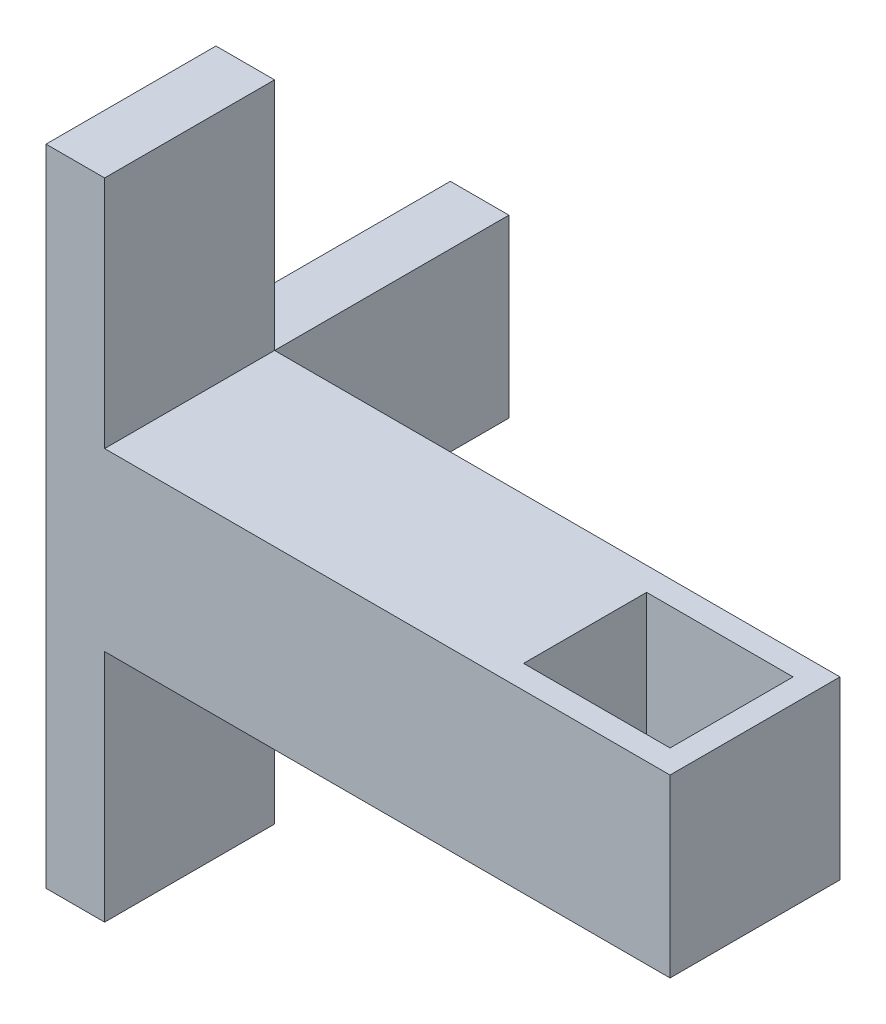
ISO-10303-21;
HEADER;
FILE_DESCRIPTION(('STEP AP214'),'2;1');
FILE_NAME('part.step','',(''),(''),'','','');
FILE_SCHEMA(('AUTOMOTIVE_DESIGN { 1 0 10303 214 1 1 1 1 }'));
ENDSEC;
DATA;
#1=APPLICATION_CONTEXT('core data for automotive mechanical design processes');
#2=APPLICATION_PROTOCOL_DEFINITION('international standard','automotive_design',2000,#1);
#3=PRODUCT_CONTEXT('',#1,'mechanical');
#4=PRODUCT('Part','Part','',(#3));
#5=PRODUCT_RELATED_PRODUCT_CATEGORY('part','',(#4));
#6=PRODUCT_DEFINITION_FORMATION('','',#4);
#7=PRODUCT_DEFINITION_CONTEXT('part definition',#1,'design');
#8=PRODUCT_DEFINITION('design','',#6,#7);
#9=PRODUCT_DEFINITION_SHAPE('','',#8);
#10=(LENGTH_UNIT() NAMED_UNIT(*) SI_UNIT(.MILLI.,.METRE.));
#11=(NAMED_UNIT(*) PLANE_ANGLE_UNIT() SI_UNIT($,.RADIAN.));
#12=(NAMED_UNIT(*) SI_UNIT($,.STERADIAN.) SOLID_ANGLE_UNIT());
#13=UNCERTAINTY_MEASURE_WITH_UNIT(LENGTH_MEASURE(1.E-05),#10,'distance_accuracy_value','');
#14=(GEOMETRIC_REPRESENTATION_CONTEXT(3) GLOBAL_UNCERTAINTY_ASSIGNED_CONTEXT((#13)) GLOBAL_UNIT_ASSIGNED_CONTEXT((#10,
#11,#12)) REPRESENTATION_CONTEXT('',''));
#15=CARTESIAN_POINT('',(0.,0.,0.));
#16=DIRECTION('',(0.,0.,1.));
#17=DIRECTION('',(1.,0.,0.));
#18=AXIS2_PLACEMENT_3D('',#15,#16,#17);
#19=CARTESIAN_POINT('',(0.,15.,0.));
#20=DIRECTION('',(0.,1.,0.));
#21=DIRECTION('',(0.,0.,1.));
#22=AXIS2_PLACEMENT_3D('',#19,#20,#21);
#23=PLANE('',#22);
#24=DIRECTION('',(-1.,0.,0.));
#25=VECTOR('',#24,1.);
#26=CARTESIAN_POINT('',(0.,15.,-2.));
#27=LINE('',#26,#25);
#28=CARTESIAN_POINT('',(-33.75,15.,-2.));
#29=VERTEX_POINT('',#28);
#30=CARTESIAN_POINT('',(-38.75,15.,-2.));
#31=VERTEX_POINT('',#30);
#32=EDGE_CURVE('E157',#29,#31,#27,.T.);
#33=ORIENTED_EDGE('',*,*,#32,.F.);
#34=DIRECTION('',(0.,0.,-1.));
#35=VECTOR('',#34,1.);
#36=CARTESIAN_POINT('',(-33.75,15.,0.));
#37=LINE('',#36,#35);
#38=CARTESIAN_POINT('',(-33.75,15.,-22.));
#39=VERTEX_POINT('',#38);
#40=EDGE_CURVE('E226',#29,#39,#37,.T.);
#41=ORIENTED_EDGE('',*,*,#40,.T.);
#42=DIRECTION('',(-1.,0.,0.));
#43=VECTOR('',#42,1.);
#44=CARTESIAN_POINT('',(0.,15.,-22.));
#45=LINE('',#44,#43);
#46=CARTESIAN_POINT('',(-38.75,15.,-22.));
#47=VERTEX_POINT('',#46);
#48=EDGE_CURVE('E229',#39,#47,#45,.T.);
#49=ORIENTED_EDGE('',*,*,#48,.T.);
#50=DIRECTION('',(0.,0.,1.));
#51=VECTOR('',#50,1.);
#52=CARTESIAN_POINT('',(-38.75,15.,0.));
#53=LINE('',#52,#51);
#54=EDGE_CURVE('E57',#47,#31,#53,.T.);
#55=ORIENTED_EDGE('',*,*,#54,.T.);
#56=EDGE_LOOP('',(#33,#41,#49,#55));
#57=FACE_BOUND('',#56,.T.);
#58=ADVANCED_FACE('F41',(#57),#23,.T.);
#59=CARTESIAN_POINT('',(0.,0.,0.));
#60=DIRECTION('',(0.,1.,0.));
#61=DIRECTION('',(0.,0.,1.));
#62=AXIS2_PLACEMENT_3D('',#59,#60,#61);
#63=PLANE('',#62);
#64=DIRECTION('',(0.,0.,-1.));
#65=VECTOR('',#64,1.);
#66=CARTESIAN_POINT('',(-33.75,0.,0.));
#67=LINE('',#66,#65);
#68=CARTESIAN_POINT('',(-33.75,0.,-2.));
#69=VERTEX_POINT('',#68);
#70=CARTESIAN_POINT('',(-33.75,0.,-22.));
#71=VERTEX_POINT('',#70);
#72=EDGE_CURVE('E260',#69,#71,#67,.T.);
#73=ORIENTED_EDGE('',*,*,#72,.F.);
#74=DIRECTION('',(-1.,0.,0.));
#75=VECTOR('',#74,1.);
#76=CARTESIAN_POINT('',(0.,0.,-2.));
#77=LINE('',#76,#75);
#78=CARTESIAN_POINT('',(-38.75,0.,-2.));
#79=VERTEX_POINT('',#78);
#80=EDGE_CURVE('E11',#69,#79,#77,.T.);
#81=ORIENTED_EDGE('',*,*,#80,.T.);
#82=DIRECTION('',(0.,0.,1.));
#83=VECTOR('',#82,1.);
#84=CARTESIAN_POINT('',(-38.75,0.,0.));
#85=LINE('',#84,#83);
#86=CARTESIAN_POINT('',(-38.75,0.,-22.));
#87=VERTEX_POINT('',#86);
#88=EDGE_CURVE('E266',#87,#79,#85,.T.);
#89=ORIENTED_EDGE('',*,*,#88,.F.);
#90=DIRECTION('',(-1.,0.,0.));
#91=VECTOR('',#90,1.);
#92=CARTESIAN_POINT('',(0.,0.,-22.));
#93=LINE('',#92,#91);
#94=EDGE_CURVE('E263',#71,#87,#93,.T.);
#95=ORIENTED_EDGE('',*,*,#94,.F.);
#96=EDGE_LOOP('',(#73,#81,#89,#95));
#97=FACE_BOUND('',#96,.T.);
#98=ADVANCED_FACE('F334',(#97),#63,.F.);
#99=CARTESIAN_POINT('',(0.,15.,0.));
#100=DIRECTION('',(0.,0.,-1.));
#101=DIRECTION('',(-1.,0.,0.));
#102=AXIS2_PLACEMENT_3D('',#99,#100,#101);
#103=PLANE('',#102);
#104=DIRECTION('',(1.,0.,0.));
#105=VECTOR('',#104,1.);
#106=CARTESIAN_POINT('',(0.,0.,0.));
#107=LINE('',#106,#105);
#108=CARTESIAN_POINT('',(0.,0.,0.));
#109=VERTEX_POINT('',#108);
#110=CARTESIAN_POINT('',(12.5,0.,0.));
#111=VERTEX_POINT('',#110);
#112=EDGE_CURVE('E269',#109,#111,#107,.T.);
#113=ORIENTED_EDGE('',*,*,#112,.T.);
#114=DIRECTION('',(0.,-1.,0.));
#115=VECTOR('',#114,1.);
#116=CARTESIAN_POINT('',(12.5,15.,0.));
#117=LINE('',#116,#115);
#118=CARTESIAN_POINT('',(12.5,15.,0.));
#119=VERTEX_POINT('',#118);
#120=EDGE_CURVE('E294',#119,#111,#117,.T.);
#121=ORIENTED_EDGE('',*,*,#120,.F.);
#122=DIRECTION('',(1.,0.,0.));
#123=VECTOR('',#122,1.);
#124=CARTESIAN_POINT('',(0.,15.,0.));
#125=LINE('',#124,#123);
#126=CARTESIAN_POINT('',(0.,15.,0.));
#127=VERTEX_POINT('',#126);
#128=EDGE_CURVE('E234',#127,#119,#125,.T.);
#129=ORIENTED_EDGE('',*,*,#128,.F.);
#130=DIRECTION('',(0.,-1.,0.));
#131=VECTOR('',#130,1.);
#132=CARTESIAN_POINT('',(0.,15.,0.));
#133=LINE('',#132,#131);
#134=EDGE_CURVE('E284',#127,#109,#133,.T.);
#135=ORIENTED_EDGE('',*,*,#134,.T.);
#136=EDGE_LOOP('',(#113,#121,#129,#135));
#137=FACE_BOUND('',#136,.T.);
#138=ADVANCED_FACE('F361',(#137),#103,.F.);
#139=CARTESIAN_POINT('',(12.5,15.,0.));
#140=DIRECTION('',(1.,0.,0.));
#141=DIRECTION('',(0.,0.,-1.));
#142=AXIS2_PLACEMENT_3D('',#139,#140,#141);
#143=PLANE('',#142);
#144=DIRECTION('',(0.,0.,1.));
#145=VECTOR('',#144,1.);
#146=CARTESIAN_POINT('',(12.5,0.,0.));
#147=LINE('',#146,#145);
#148=CARTESIAN_POINT('',(12.5,0.,10.5));
#149=VERTEX_POINT('',#148);
#150=EDGE_CURVE('E273',#111,#149,#147,.T.);
#151=ORIENTED_EDGE('',*,*,#150,.T.);
#152=DIRECTION('',(0.,-1.,0.));
#153=VECTOR('',#152,1.);
#154=CARTESIAN_POINT('',(12.5,15.,10.5));
#155=LINE('',#154,#153);
#156=CARTESIAN_POINT('',(12.5,15.,10.5));
#157=VERTEX_POINT('',#156);
#158=EDGE_CURVE('E291',#157,#149,#155,.T.);
#159=ORIENTED_EDGE('',*,*,#158,.F.);
#160=DIRECTION('',(0.,0.,1.));
#161=VECTOR('',#160,1.);
#162=CARTESIAN_POINT('',(12.5,15.,0.));
#163=LINE('',#162,#161);
#164=EDGE_CURVE('E238',#119,#157,#163,.T.);
#165=ORIENTED_EDGE('',*,*,#164,.F.);
#166=ORIENTED_EDGE('',*,*,#120,.T.);
#167=EDGE_LOOP('',(#151,#159,#165,#166));
#168=FACE_BOUND('',#167,.T.);
#169=ADVANCED_FACE('F364',(#168),#143,.F.);
#170=CARTESIAN_POINT('',(0.,15.,10.5));
#171=DIRECTION('',(0.,0.,-1.));
#172=DIRECTION('',(-1.,0.,0.));
#173=AXIS2_PLACEMENT_3D('',#170,#171,#172);
#174=PLANE('',#173);
#175=DIRECTION('',(1.,0.,0.));
#176=VECTOR('',#175,1.);
#177=CARTESIAN_POINT('',(0.,0.,10.5));
#178=LINE('',#177,#176);
#179=CARTESIAN_POINT('',(0.,0.,10.5));
#180=VERTEX_POINT('',#179);
#181=EDGE_CURVE('E277',#180,#149,#178,.T.);
#182=ORIENTED_EDGE('',*,*,#181,.F.);
#183=DIRECTION('',(0.,-1.,0.));
#184=VECTOR('',#183,1.);
#185=CARTESIAN_POINT('',(0.,15.,10.5));
#186=LINE('',#185,#184);
#187=CARTESIAN_POINT('',(0.,15.,10.5));
#188=VERTEX_POINT('',#187);
#189=EDGE_CURVE('E287',#188,#180,#186,.T.);
#190=ORIENTED_EDGE('',*,*,#189,.F.);
#191=DIRECTION('',(1.,0.,0.));
#192=VECTOR('',#191,1.);
#193=CARTESIAN_POINT('',(0.,15.,10.5));
#194=LINE('',#193,#192);
#195=EDGE_CURVE('E241',#188,#157,#194,.T.);
#196=ORIENTED_EDGE('',*,*,#195,.T.);
#197=ORIENTED_EDGE('',*,*,#158,.T.);
#198=EDGE_LOOP('',(#182,#190,#196,#197));
#199=FACE_BOUND('',#198,.T.);
#200=ADVANCED_FACE('F367',(#199),#174,.T.);
#201=CARTESIAN_POINT('',(0.,15.,12.5));
#202=DIRECTION('',(0.,0.,1.));
#203=DIRECTION('',(1.,0.,0.));
#204=AXIS2_PLACEMENT_3D('',#201,#202,#203);
#205=PLANE('',#204);
#206=DIRECTION('',(-1.,0.,0.));
#207=VECTOR('',#206,1.);
#208=CARTESIAN_POINT('',(0.,15.,12.5));
#209=LINE('',#208,#207);
#210=CARTESIAN_POINT('',(14.5,15.,12.5));
#211=VERTEX_POINT('',#210);
#212=CARTESIAN_POINT('',(-33.75,15.,12.5));
#213=VERTEX_POINT('',#212);
#214=EDGE_CURVE('E214',#211,#213,#209,.T.);
#215=ORIENTED_EDGE('',*,*,#214,.T.);
#216=DIRECTION('',(0.,-1.,0.));
#217=VECTOR('',#216,1.);
#218=CARTESIAN_POINT('',(-33.75,35.,12.5));
#219=LINE('',#218,#217);
#220=CARTESIAN_POINT('',(-33.75,35.,12.5));
#221=VERTEX_POINT('',#220);
#222=EDGE_CURVE('E189',#221,#213,#219,.T.);
#223=ORIENTED_EDGE('',*,*,#222,.F.);
#224=DIRECTION('',(1.,0.,0.));
#225=VECTOR('',#224,1.);
#226=CARTESIAN_POINT('',(-38.75,35.,12.5));
#227=LINE('',#226,#225);
#228=CARTESIAN_POINT('',(-38.75,35.,12.5));
#229=VERTEX_POINT('',#228);
#230=EDGE_CURVE('E171',#229,#221,#227,.T.);
#231=ORIENTED_EDGE('',*,*,#230,.F.);
#232=DIRECTION('',(0.,-1.,0.));
#233=VECTOR('',#232,1.);
#234=CARTESIAN_POINT('',(-38.75,15.,12.5));
#235=LINE('',#234,#233);
#236=CARTESIAN_POINT('',(-38.75,-20.,12.5));
#237=VERTEX_POINT('',#236);
#238=EDGE_CURVE('E177',#229,#237,#235,.T.);
#239=ORIENTED_EDGE('',*,*,#238,.T.);
#240=DIRECTION('',(1.,0.,0.));
#241=VECTOR('',#240,1.);
#242=CARTESIAN_POINT('',(-38.75,-20.,12.5));
#243=LINE('',#242,#241);
#244=CARTESIAN_POINT('',(-33.75,-20.,12.5));
#245=VERTEX_POINT('',#244);
#246=EDGE_CURVE('E203',#237,#245,#243,.T.);
#247=ORIENTED_EDGE('',*,*,#246,.T.);
#248=CARTESIAN_POINT('',(-33.75,0.,12.5));
#249=VERTEX_POINT('',#248);
#250=EDGE_CURVE('E188',#249,#245,#219,.T.);
#251=ORIENTED_EDGE('',*,*,#250,.F.);
#252=DIRECTION('',(-1.,0.,0.));
#253=VECTOR('',#252,1.);
#254=CARTESIAN_POINT('',(0.,0.,12.5));
#255=LINE('',#254,#253);
#256=CARTESIAN_POINT('',(14.5,0.,12.5));
#257=VERTEX_POINT('',#256);
#258=EDGE_CURVE('E213',#257,#249,#255,.T.);
#259=ORIENTED_EDGE('',*,*,#258,.F.);
#260=DIRECTION('',(0.,-1.,0.));
#261=VECTOR('',#260,1.);
#262=CARTESIAN_POINT('',(14.5,15.,12.5));
#263=LINE('',#262,#261);
#264=EDGE_CURVE('E288',#211,#257,#263,.T.);
#265=ORIENTED_EDGE('',*,*,#264,.F.);
#266=EDGE_LOOP('',(#215,#223,#231,#239,#247,#251,#259,#265));
#267=FACE_BOUND('',#266,.T.);
#268=ADVANCED_FACE('F43',(#267),#205,.T.);
#269=CARTESIAN_POINT('',(14.5,15.,0.));
#270=DIRECTION('',(1.,0.,0.));
#271=DIRECTION('',(0.,0.,-1.));
#272=AXIS2_PLACEMENT_3D('',#269,#270,#271);
#273=PLANE('',#272);
#274=DIRECTION('',(0.,0.,1.));
#275=VECTOR('',#274,1.);
#276=CARTESIAN_POINT('',(14.5,0.,0.));
#277=LINE('',#276,#275);
#278=CARTESIAN_POINT('',(14.5,0.,-2.));
#279=VERTEX_POINT('',#278);
#280=EDGE_CURVE('E252',#279,#257,#277,.T.);
#281=ORIENTED_EDGE('',*,*,#280,.F.);
#282=DIRECTION('',(0.,-1.,0.));
#283=VECTOR('',#282,1.);
#284=CARTESIAN_POINT('',(14.5,15.,-2.));
#285=LINE('',#284,#283);
#286=CARTESIAN_POINT('',(14.5,15.,-2.));
#287=VERTEX_POINT('',#286);
#288=EDGE_CURVE('E312',#287,#279,#285,.T.);
#289=ORIENTED_EDGE('',*,*,#288,.F.);
#290=DIRECTION('',(0.,0.,1.));
#291=VECTOR('',#290,1.);
#292=CARTESIAN_POINT('',(14.5,15.,0.));
#293=LINE('',#292,#291);
#294=EDGE_CURVE('E217',#287,#211,#293,.T.);
#295=ORIENTED_EDGE('',*,*,#294,.T.);
#296=ORIENTED_EDGE('',*,*,#264,.T.);
#297=EDGE_LOOP('',(#281,#289,#295,#296));
#298=FACE_BOUND('',#297,.T.);
#299=ADVANCED_FACE('F341',(#298),#273,.T.);
#300=CARTESIAN_POINT('',(0.,15.,-2.));
#301=DIRECTION('',(0.,0.,-1.));
#302=DIRECTION('',(-1.,0.,0.));
#303=AXIS2_PLACEMENT_3D('',#300,#301,#302);
#304=PLANE('',#303);
#305=DIRECTION('',(1.,0.,0.));
#306=VECTOR('',#305,1.);
#307=CARTESIAN_POINT('',(0.,0.,-2.));
#308=LINE('',#307,#306);
#309=EDGE_CURVE('E256',#69,#279,#308,.T.);
#310=ORIENTED_EDGE('',*,*,#309,.F.);
#311=DIRECTION('',(0.,-1.,0.));
#312=VECTOR('',#311,1.);
#313=CARTESIAN_POINT('',(-33.75,15.,-2.));
#314=LINE('',#313,#312);
#315=EDGE_CURVE('E308',#29,#69,#314,.T.);
#316=ORIENTED_EDGE('',*,*,#315,.F.);
#317=DIRECTION('',(1.,0.,0.));
#318=VECTOR('',#317,1.);
#319=CARTESIAN_POINT('',(0.,15.,-2.));
#320=LINE('',#319,#318);
#321=EDGE_CURVE('E222',#29,#287,#320,.T.);
#322=ORIENTED_EDGE('',*,*,#321,.T.);
#323=ORIENTED_EDGE('',*,*,#288,.T.);
#324=EDGE_LOOP('',(#310,#316,#322,#323));
#325=FACE_BOUND('',#324,.T.);
#326=ADVANCED_FACE('F337',(#325),#304,.T.);
#327=CARTESIAN_POINT('',(-33.75,15.,0.));
#328=DIRECTION('',(-1.,0.,0.));
#329=DIRECTION('',(0.,0.,1.));
#330=AXIS2_PLACEMENT_3D('',#327,#328,#329);
#331=PLANE('',#330);
#332=ORIENTED_EDGE('',*,*,#72,.T.);
#333=DIRECTION('',(0.,-1.,0.));
#334=VECTOR('',#333,1.);
#335=CARTESIAN_POINT('',(-33.75,15.,-22.));
#336=LINE('',#335,#334);
#337=EDGE_CURVE('E304',#39,#71,#336,.T.);
#338=ORIENTED_EDGE('',*,*,#337,.F.);
#339=ORIENTED_EDGE('',*,*,#40,.F.);
#340=ORIENTED_EDGE('',*,*,#315,.T.);
#341=EDGE_LOOP('',(#332,#338,#339,#340));
#342=FACE_BOUND('',#341,.T.);
#343=ADVANCED_FACE('F329',(#342),#331,.F.);
#344=CARTESIAN_POINT('',(0.,15.,-22.));
#345=DIRECTION('',(0.,0.,1.));
#346=DIRECTION('',(1.,0.,0.));
#347=AXIS2_PLACEMENT_3D('',#344,#345,#346);
#348=PLANE('',#347);
#349=ORIENTED_EDGE('',*,*,#94,.T.);
#350=DIRECTION('',(0.,-1.,0.));
#351=VECTOR('',#350,1.);
#352=CARTESIAN_POINT('',(-38.75,15.,-22.));
#353=LINE('',#352,#351);
#354=EDGE_CURVE('E300',#47,#87,#353,.T.);
#355=ORIENTED_EDGE('',*,*,#354,.F.);
#356=ORIENTED_EDGE('',*,*,#48,.F.);
#357=ORIENTED_EDGE('',*,*,#337,.T.);
#358=EDGE_LOOP('',(#349,#355,#356,#357));
#359=FACE_BOUND('',#358,.T.);
#360=ADVANCED_FACE('F405',(#359),#348,.F.);
#361=CARTESIAN_POINT('',(-38.75,15.,0.));
#362=DIRECTION('',(1.,0.,0.));
#363=DIRECTION('',(0.,0.,-1.));
#364=AXIS2_PLACEMENT_3D('',#361,#362,#363);
#365=PLANE('',#364);
#366=ORIENTED_EDGE('',*,*,#88,.T.);
#367=DIRECTION('',(0.,1.,0.));
#368=VECTOR('',#367,1.);
#369=CARTESIAN_POINT('',(-38.75,15.,-2.));
#370=LINE('',#369,#368);
#371=CARTESIAN_POINT('',(-38.75,-20.,-2.));
#372=VERTEX_POINT('',#371);
#373=EDGE_CURVE('E161',#372,#79,#370,.T.);
#374=ORIENTED_EDGE('',*,*,#373,.F.);
#375=DIRECTION('',(0.,0.,-1.));
#376=VECTOR('',#375,1.);
#377=CARTESIAN_POINT('',(-38.75,-20.,12.5));
#378=LINE('',#377,#376);
#379=EDGE_CURVE('E172',#237,#372,#378,.T.);
#380=ORIENTED_EDGE('',*,*,#379,.F.);
#381=ORIENTED_EDGE('',*,*,#238,.F.);
#382=DIRECTION('',(0.,0.,1.));
#383=VECTOR('',#382,1.);
#384=CARTESIAN_POINT('',(-38.75,35.,-2.));
#385=LINE('',#384,#383);
#386=CARTESIAN_POINT('',(-38.75,35.,-2.));
#387=VERTEX_POINT('',#386);
#388=EDGE_CURVE('E167',#387,#229,#385,.T.);
#389=ORIENTED_EDGE('',*,*,#388,.F.);
#390=EDGE_CURVE('E151',#31,#387,#370,.T.);
#391=ORIENTED_EDGE('',*,*,#390,.F.);
#392=ORIENTED_EDGE('',*,*,#54,.F.);
#393=ORIENTED_EDGE('',*,*,#354,.T.);
#394=EDGE_LOOP('',(#366,#374,#380,#381,#389,#391,#392,#393));
#395=FACE_BOUND('',#394,.T.);
#396=ADVANCED_FACE('F175',(#395),#365,.F.);
#397=CARTESIAN_POINT('',(0.,15.,0.));
#398=DIRECTION('',(1.,0.,0.));
#399=DIRECTION('',(0.,0.,-1.));
#400=AXIS2_PLACEMENT_3D('',#397,#398,#399);
#401=PLANE('',#400);
#402=DIRECTION('',(0.,0.,1.));
#403=VECTOR('',#402,1.);
#404=CARTESIAN_POINT('',(0.,0.,0.));
#405=LINE('',#404,#403);
#406=EDGE_CURVE('E218',#109,#180,#405,.T.);
#407=ORIENTED_EDGE('',*,*,#406,.F.);
#408=ORIENTED_EDGE('',*,*,#134,.F.);
#409=DIRECTION('',(0.,0.,1.));
#410=VECTOR('',#409,1.);
#411=CARTESIAN_POINT('',(0.,15.,0.));
#412=LINE('',#411,#410);
#413=EDGE_CURVE('E245',#127,#188,#412,.T.);
#414=ORIENTED_EDGE('',*,*,#413,.T.);
#415=ORIENTED_EDGE('',*,*,#189,.T.);
#416=EDGE_LOOP('',(#407,#408,#414,#415));
#417=FACE_BOUND('',#416,.T.);
#418=ADVANCED_FACE('F353',(#417),#401,.T.);
#419=DIRECTION('',(0.,0.,-1.));
#420=VECTOR('',#419,1.);
#421=CARTESIAN_POINT('',(-33.75,15.,0.));
#422=LINE('',#421,#420);
#423=EDGE_CURVE('E65',#213,#29,#422,.T.);
#424=ORIENTED_EDGE('',*,*,#423,.F.);
#425=ORIENTED_EDGE('',*,*,#214,.F.);
#426=ORIENTED_EDGE('',*,*,#294,.F.);
#427=ORIENTED_EDGE('',*,*,#321,.F.);
#428=EDGE_LOOP('',(#424,#425,#426,#427));
#429=FACE_BOUND('',#428,.T.);
#430=ORIENTED_EDGE('',*,*,#128,.T.);
#431=ORIENTED_EDGE('',*,*,#164,.T.);
#432=ORIENTED_EDGE('',*,*,#195,.F.);
#433=ORIENTED_EDGE('',*,*,#413,.F.);
#434=EDGE_LOOP('',(#430,#431,#432,#433));
#435=FACE_BOUND('',#434,.T.);
#436=ADVANCED_FACE('F350',(#429,#435),#23,.T.);
#437=ORIENTED_EDGE('',*,*,#258,.T.);
#438=DIRECTION('',(0.,0.,-1.));
#439=VECTOR('',#438,1.);
#440=CARTESIAN_POINT('',(-33.75,0.,0.));
#441=LINE('',#440,#439);
#442=EDGE_CURVE('E50',#249,#69,#441,.T.);
#443=ORIENTED_EDGE('',*,*,#442,.T.);
#444=ORIENTED_EDGE('',*,*,#309,.T.);
#445=ORIENTED_EDGE('',*,*,#280,.T.);
#446=EDGE_LOOP('',(#437,#443,#444,#445));
#447=FACE_BOUND('',#446,.T.);
#448=ORIENTED_EDGE('',*,*,#112,.F.);
#449=ORIENTED_EDGE('',*,*,#406,.T.);
#450=ORIENTED_EDGE('',*,*,#181,.T.);
#451=ORIENTED_EDGE('',*,*,#150,.F.);
#452=EDGE_LOOP('',(#448,#449,#450,#451));
#453=FACE_BOUND('',#452,.T.);
#454=ADVANCED_FACE('F319',(#447,#453),#63,.F.);
#455=CARTESIAN_POINT('',(-38.75,-20.,12.5));
#456=DIRECTION('',(0.,-1.,0.));
#457=DIRECTION('',(0.,0.,-1.));
#458=AXIS2_PLACEMENT_3D('',#455,#456,#457);
#459=PLANE('',#458);
#460=DIRECTION('',(0.,0.,-1.));
#461=VECTOR('',#460,1.);
#462=CARTESIAN_POINT('',(-33.75,-20.,12.5));
#463=LINE('',#462,#461);
#464=CARTESIAN_POINT('',(-33.75,-20.,-2.));
#465=VERTEX_POINT('',#464);
#466=EDGE_CURVE('E193',#245,#465,#463,.T.);
#467=ORIENTED_EDGE('',*,*,#466,.F.);
#468=ORIENTED_EDGE('',*,*,#246,.F.);
#469=ORIENTED_EDGE('',*,*,#379,.T.);
#470=DIRECTION('',(1.,0.,0.));
#471=VECTOR('',#470,1.);
#472=CARTESIAN_POINT('',(-38.75,-20.,-2.));
#473=LINE('',#472,#471);
#474=EDGE_CURVE('E200',#372,#465,#473,.T.);
#475=ORIENTED_EDGE('',*,*,#474,.T.);
#476=EDGE_LOOP('',(#467,#468,#469,#475));
#477=FACE_BOUND('',#476,.T.);
#478=ADVANCED_FACE('F371',(#477),#459,.T.);
#479=CARTESIAN_POINT('',(-33.75,0.,0.));
#480=DIRECTION('',(1.,0.,0.));
#481=DIRECTION('',(0.,0.,-1.));
#482=AXIS2_PLACEMENT_3D('',#479,#480,#481);
#483=PLANE('',#482);
#484=ORIENTED_EDGE('',*,*,#442,.F.);
#485=ORIENTED_EDGE('',*,*,#250,.T.);
#486=ORIENTED_EDGE('',*,*,#466,.T.);
#487=DIRECTION('',(0.,1.,0.));
#488=VECTOR('',#487,1.);
#489=CARTESIAN_POINT('',(-33.75,-20.,-2.));
#490=LINE('',#489,#488);
#491=EDGE_CURVE('E162',#465,#69,#490,.T.);
#492=ORIENTED_EDGE('',*,*,#491,.T.);
#493=EDGE_LOOP('',(#484,#485,#486,#492));
#494=FACE_BOUND('',#493,.T.);
#495=ADVANCED_FACE('F376',(#494),#483,.T.);
#496=CARTESIAN_POINT('',(-38.75,-20.,-2.));
#497=DIRECTION('',(0.,0.,-1.));
#498=DIRECTION('',(-1.,0.,0.));
#499=AXIS2_PLACEMENT_3D('',#496,#497,#498);
#500=PLANE('',#499);
#501=ORIENTED_EDGE('',*,*,#80,.F.);
#502=ORIENTED_EDGE('',*,*,#491,.F.);
#503=ORIENTED_EDGE('',*,*,#474,.F.);
#504=ORIENTED_EDGE('',*,*,#373,.T.);
#505=EDGE_LOOP('',(#501,#502,#503,#504));
#506=FACE_BOUND('',#505,.T.);
#507=ADVANCED_FACE('F389',(#506),#500,.T.);
#508=CARTESIAN_POINT('',(-33.75,35.,-2.));
#509=VERTEX_POINT('',#508);
#510=EDGE_CURVE('E197',#29,#509,#490,.T.);
#511=ORIENTED_EDGE('',*,*,#510,.F.);
#512=ORIENTED_EDGE('',*,*,#32,.T.);
#513=ORIENTED_EDGE('',*,*,#390,.T.);
#514=DIRECTION('',(1.,0.,0.));
#515=VECTOR('',#514,1.);
#516=CARTESIAN_POINT('',(-38.75,35.,-2.));
#517=LINE('',#516,#515);
#518=EDGE_CURVE('E155',#387,#509,#517,.T.);
#519=ORIENTED_EDGE('',*,*,#518,.T.);
#520=EDGE_LOOP('',(#511,#512,#513,#519));
#521=FACE_BOUND('',#520,.T.);
#522=ADVANCED_FACE('F154',(#521),#500,.T.);
#523=CARTESIAN_POINT('',(-38.75,35.,-2.));
#524=DIRECTION('',(0.,1.,0.));
#525=DIRECTION('',(0.,0.,1.));
#526=AXIS2_PLACEMENT_3D('',#523,#524,#525);
#527=PLANE('',#526);
#528=DIRECTION('',(0.,0.,1.));
#529=VECTOR('',#528,1.);
#530=CARTESIAN_POINT('',(-33.75,35.,-2.));
#531=LINE('',#530,#529);
#532=EDGE_CURVE('E169',#509,#221,#531,.T.);
#533=ORIENTED_EDGE('',*,*,#532,.F.);
#534=ORIENTED_EDGE('',*,*,#518,.F.);
#535=ORIENTED_EDGE('',*,*,#388,.T.);
#536=ORIENTED_EDGE('',*,*,#230,.T.);
#537=EDGE_LOOP('',(#533,#534,#535,#536));
#538=FACE_BOUND('',#537,.T.);
#539=ADVANCED_FACE('F166',(#538),#527,.T.);
#540=ORIENTED_EDGE('',*,*,#222,.T.);
#541=ORIENTED_EDGE('',*,*,#423,.T.);
#542=ORIENTED_EDGE('',*,*,#510,.T.);
#543=ORIENTED_EDGE('',*,*,#532,.T.);
#544=EDGE_LOOP('',(#540,#541,#542,#543));
#545=FACE_BOUND('',#544,.T.);
#546=ADVANCED_FACE('F348',(#545),#483,.T.);
#547=CLOSED_SHELL('',(#58,#98,#138,#169,#200,#268,#299,#326,#343,#360,#396,#418,#436,#454,#478,
#495,#507,#522,#539,#546));
#548=MANIFOLD_SOLID_BREP('B2',#547);
#549=ADVANCED_BREP_SHAPE_REPRESENTATION('',(#18,#548),#14);
#550=SHAPE_DEFINITION_REPRESENTATION(#9,#549);
ENDSEC;
END-ISO-10303-21;
